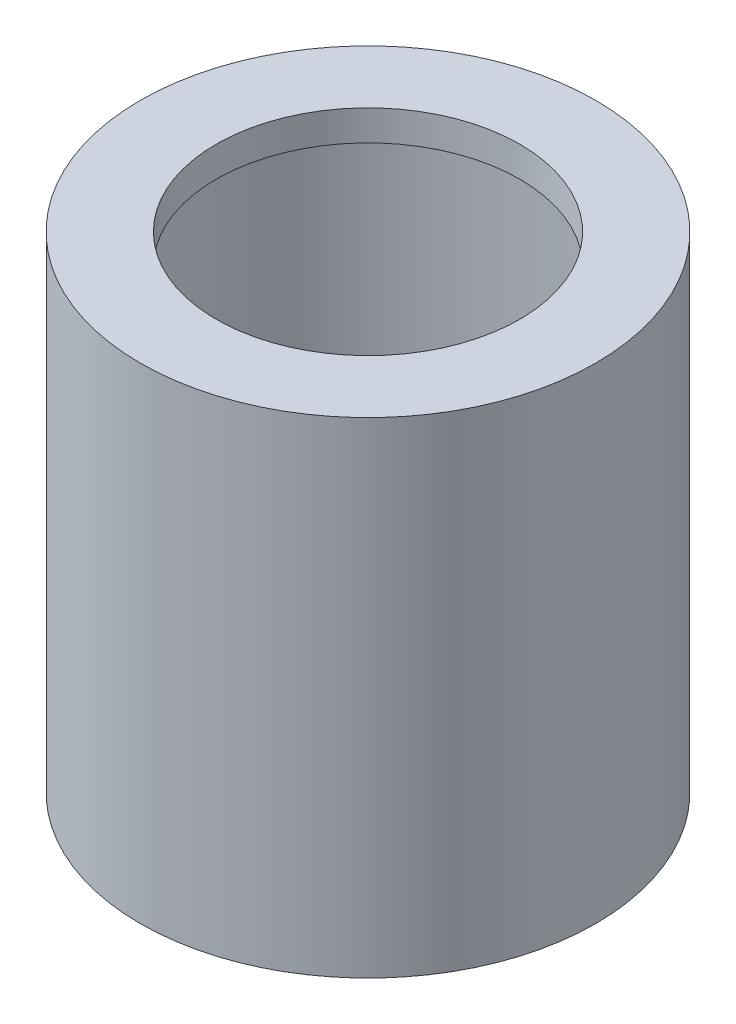
ISO-10303-21;
HEADER;
FILE_DESCRIPTION(('STEP AP214'),'2;1');
FILE_NAME('part.step','',(''),(''),'','','');
FILE_SCHEMA(('AUTOMOTIVE_DESIGN { 1 0 10303 214 1 1 1 1 }'));
ENDSEC;
DATA;
#1=APPLICATION_CONTEXT('core data for automotive mechanical design processes');
#2=APPLICATION_PROTOCOL_DEFINITION('international standard','automotive_design',2000,#1);
#3=PRODUCT_CONTEXT('',#1,'mechanical');
#4=PRODUCT('Part','Part','',(#3));
#5=PRODUCT_RELATED_PRODUCT_CATEGORY('part','',(#4));
#6=PRODUCT_DEFINITION_FORMATION('','',#4);
#7=PRODUCT_DEFINITION_CONTEXT('part definition',#1,'design');
#8=PRODUCT_DEFINITION('design','',#6,#7);
#9=PRODUCT_DEFINITION_SHAPE('','',#8);
#10=(LENGTH_UNIT() NAMED_UNIT(*) SI_UNIT(.MILLI.,.METRE.));
#11=(NAMED_UNIT(*) PLANE_ANGLE_UNIT() SI_UNIT($,.RADIAN.));
#12=(NAMED_UNIT(*) SI_UNIT($,.STERADIAN.) SOLID_ANGLE_UNIT());
#13=UNCERTAINTY_MEASURE_WITH_UNIT(LENGTH_MEASURE(1.E-05),#10,'distance_accuracy_value','');
#14=(GEOMETRIC_REPRESENTATION_CONTEXT(3) GLOBAL_UNCERTAINTY_ASSIGNED_CONTEXT((#13)) GLOBAL_UNIT_ASSIGNED_CONTEXT((#10,
#11,#12)) REPRESENTATION_CONTEXT('',''));
#15=CARTESIAN_POINT('',(0.,0.,0.));
#16=DIRECTION('',(0.,0.,1.));
#17=DIRECTION('',(1.,0.,0.));
#18=AXIS2_PLACEMENT_3D('',#15,#16,#17);
#19=CARTESIAN_POINT('',(-11.90625,0.,0.));
#20=DIRECTION('',(0.,1.,0.));
#21=DIRECTION('',(0.,0.,1.));
#22=AXIS2_PLACEMENT_3D('',#19,#20,#21);
#23=PLANE('',#22);
#24=CARTESIAN_POINT('',(0.,0.,0.));
#25=DIRECTION('',(0.,-1.,0.));
#26=DIRECTION('',(0.,0.,-1.));
#27=AXIS2_PLACEMENT_3D('',#24,#25,#26);
#28=CIRCLE('',#27,11.1125);
#29=CARTESIAN_POINT('',(0.,0.,-11.1125));
#30=VERTEX_POINT('',#29);
#31=EDGE_CURVE('E50',#30,#30,#28,.T.);
#32=ORIENTED_EDGE('',*,*,#31,.F.);
#33=EDGE_LOOP('',(#32));
#34=FACE_BOUND('',#33,.T.);
#35=CARTESIAN_POINT('',(0.,0.,0.));
#36=DIRECTION('',(0.,-1.,0.));
#37=DIRECTION('',(0.,0.,-1.));
#38=AXIS2_PLACEMENT_3D('',#35,#36,#37);
#39=CIRCLE('',#38,11.90625);
#40=CARTESIAN_POINT('',(0.,0.,-11.90625));
#41=VERTEX_POINT('',#40);
#42=EDGE_CURVE('E10',#41,#41,#39,.T.);
#43=ORIENTED_EDGE('',*,*,#42,.T.);
#44=EDGE_LOOP('',(#43));
#45=FACE_BOUND('',#44,.T.);
#46=ADVANCED_FACE('F28',(#34,#45),#23,.F.);
#47=CARTESIAN_POINT('',(0.,0.,0.));
#48=DIRECTION('',(0.,-1.,0.));
#49=DIRECTION('',(0.,0.,-1.));
#50=AXIS2_PLACEMENT_3D('',#47,#48,#49);
#51=CYLINDRICAL_SURFACE('',#50,11.90625);
#52=ORIENTED_EDGE('',*,*,#42,.F.);
#53=EDGE_LOOP('',(#52));
#54=FACE_BOUND('',#53,.T.);
#55=CARTESIAN_POINT('',(0.,25.3875946268547,0.));
#56=DIRECTION('',(0.,-1.,0.));
#57=DIRECTION('',(0.,0.,-1.));
#58=AXIS2_PLACEMENT_3D('',#55,#56,#57);
#59=CIRCLE('',#58,11.90625);
#60=CARTESIAN_POINT('',(0.,25.3875946268547,-11.90625));
#61=VERTEX_POINT('',#60);
#62=EDGE_CURVE('E34',#61,#61,#59,.T.);
#63=ORIENTED_EDGE('',*,*,#62,.T.);
#64=EDGE_LOOP('',(#63));
#65=FACE_BOUND('',#64,.T.);
#66=ADVANCED_FACE('F57',(#54,#65),#51,.T.);
#67=CARTESIAN_POINT('',(-11.90625,25.3875946268547,0.));
#68=DIRECTION('',(0.,-1.,0.));
#69=DIRECTION('',(0.,0.,-1.));
#70=AXIS2_PLACEMENT_3D('',#67,#68,#69);
#71=PLANE('',#70);
#72=ORIENTED_EDGE('',*,*,#62,.F.);
#73=EDGE_LOOP('',(#72));
#74=FACE_BOUND('',#73,.T.);
#75=CARTESIAN_POINT('',(0.,25.3875946268547,0.));
#76=DIRECTION('',(0.,-1.,0.));
#77=DIRECTION('',(0.,0.,-1.));
#78=AXIS2_PLACEMENT_3D('',#75,#76,#77);
#79=CIRCLE('',#78,7.9375);
#80=CARTESIAN_POINT('',(0.,25.3875946268547,-7.9375));
#81=VERTEX_POINT('',#80);
#82=EDGE_CURVE('E38',#81,#81,#79,.T.);
#83=ORIENTED_EDGE('',*,*,#82,.T.);
#84=EDGE_LOOP('',(#83));
#85=FACE_BOUND('',#84,.T.);
#86=ADVANCED_FACE('F61',(#74,#85),#71,.F.);
#87=CARTESIAN_POINT('',(0.,0.,0.));
#88=DIRECTION('',(0.,-1.,0.));
#89=DIRECTION('',(0.,0.,-1.));
#90=AXIS2_PLACEMENT_3D('',#87,#88,#89);
#91=CYLINDRICAL_SURFACE('',#90,7.9375);
#92=ORIENTED_EDGE('',*,*,#82,.F.);
#93=EDGE_LOOP('',(#92));
#94=FACE_BOUND('',#93,.T.);
#95=CARTESIAN_POINT('',(0.,23.8000946268547,0.));
#96=DIRECTION('',(0.,-1.,0.));
#97=DIRECTION('',(0.,0.,-1.));
#98=AXIS2_PLACEMENT_3D('',#95,#96,#97);
#99=CIRCLE('',#98,7.9375);
#100=CARTESIAN_POINT('',(0.,23.8000946268547,-7.9375));
#101=VERTEX_POINT('',#100);
#102=EDGE_CURVE('E42',#101,#101,#99,.T.);
#103=ORIENTED_EDGE('',*,*,#102,.T.);
#104=EDGE_LOOP('',(#103));
#105=FACE_BOUND('',#104,.T.);
#106=ADVANCED_FACE('F66',(#94,#105),#91,.F.);
#107=CARTESIAN_POINT('',(-7.9375,23.8000946268547,0.));
#108=DIRECTION('',(0.,1.,0.));
#109=DIRECTION('',(0.,0.,1.));
#110=AXIS2_PLACEMENT_3D('',#107,#108,#109);
#111=PLANE('',#110);
#112=ORIENTED_EDGE('',*,*,#102,.F.);
#113=EDGE_LOOP('',(#112));
#114=FACE_BOUND('',#113,.T.);
#115=CARTESIAN_POINT('',(0.,23.8000946268547,0.));
#116=DIRECTION('',(0.,-1.,0.));
#117=DIRECTION('',(0.,0.,-1.));
#118=AXIS2_PLACEMENT_3D('',#115,#116,#117);
#119=CIRCLE('',#118,11.1125);
#120=CARTESIAN_POINT('',(0.,23.8000946268547,-11.1125));
#121=VERTEX_POINT('',#120);
#122=EDGE_CURVE('E47',#121,#121,#119,.T.);
#123=ORIENTED_EDGE('',*,*,#122,.T.);
#124=EDGE_LOOP('',(#123));
#125=FACE_BOUND('',#124,.T.);
#126=ADVANCED_FACE('F72',(#114,#125),#111,.F.);
#127=CARTESIAN_POINT('',(0.,0.,0.));
#128=DIRECTION('',(0.,-1.,0.));
#129=DIRECTION('',(0.,0.,-1.));
#130=AXIS2_PLACEMENT_3D('',#127,#128,#129);
#131=CYLINDRICAL_SURFACE('',#130,11.1125);
#132=ORIENTED_EDGE('',*,*,#122,.F.);
#133=EDGE_LOOP('',(#132));
#134=FACE_BOUND('',#133,.T.);
#135=ORIENTED_EDGE('',*,*,#31,.T.);
#136=EDGE_LOOP('',(#135));
#137=FACE_BOUND('',#136,.T.);
#138=ADVANCED_FACE('F54',(#134,#137),#131,.F.);
#139=CLOSED_SHELL('',(#46,#66,#86,#106,#126,#138));
#140=MANIFOLD_SOLID_BREP('B2',#139);
#141=ADVANCED_BREP_SHAPE_REPRESENTATION('',(#18,#140),#14);
#142=SHAPE_DEFINITION_REPRESENTATION(#9,#141);
ENDSEC;
END-ISO-10303-21;
